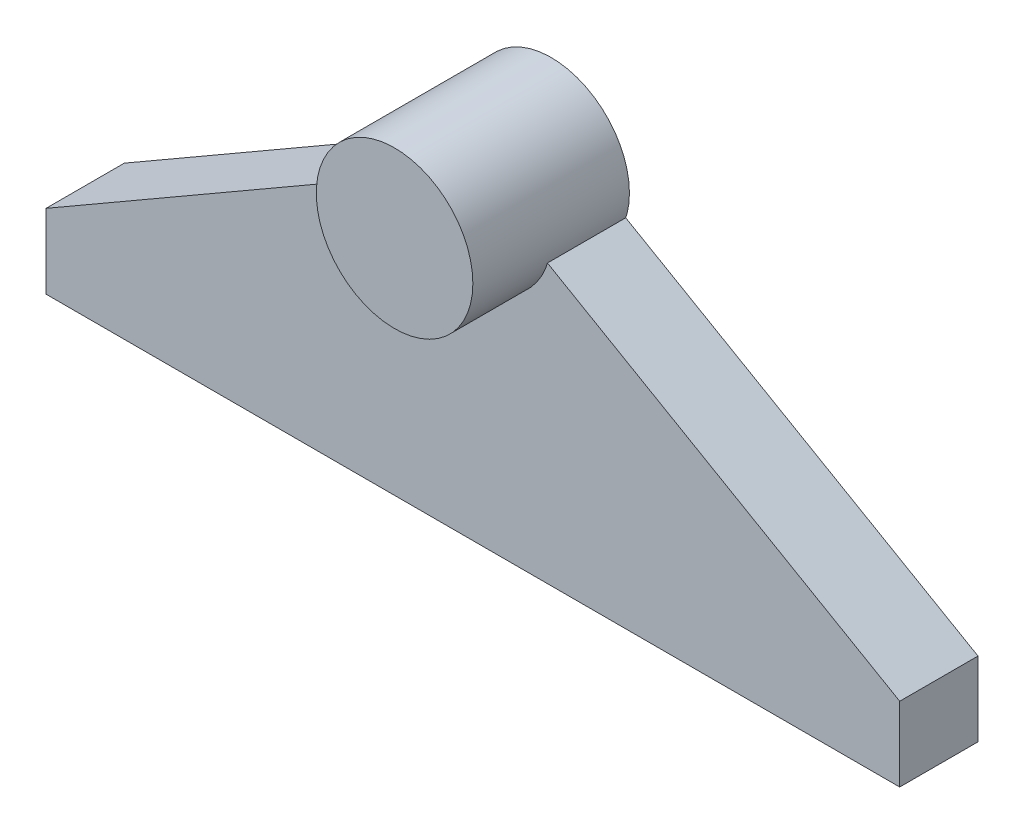
ISO-10303-21;
HEADER;
FILE_DESCRIPTION(('STEP AP214'),'2;1');
FILE_NAME('part.step','',(''),(''),'','','');
FILE_SCHEMA(('AUTOMOTIVE_DESIGN { 1 0 10303 214 1 1 1 1 }'));
ENDSEC;
DATA;
#1=APPLICATION_CONTEXT('core data for automotive mechanical design processes');
#2=APPLICATION_PROTOCOL_DEFINITION('international standard','automotive_design',2000,#1);
#3=PRODUCT_CONTEXT('',#1,'mechanical');
#4=PRODUCT('Part','Part','',(#3));
#5=PRODUCT_RELATED_PRODUCT_CATEGORY('part','',(#4));
#6=PRODUCT_DEFINITION_FORMATION('','',#4);
#7=PRODUCT_DEFINITION_CONTEXT('part definition',#1,'design');
#8=PRODUCT_DEFINITION('design','',#6,#7);
#9=PRODUCT_DEFINITION_SHAPE('','',#8);
#10=(LENGTH_UNIT() NAMED_UNIT(*) SI_UNIT(.MILLI.,.METRE.));
#11=(NAMED_UNIT(*) PLANE_ANGLE_UNIT() SI_UNIT($,.RADIAN.));
#12=(NAMED_UNIT(*) SI_UNIT($,.STERADIAN.) SOLID_ANGLE_UNIT());
#13=UNCERTAINTY_MEASURE_WITH_UNIT(LENGTH_MEASURE(1.E-05),#10,'distance_accuracy_value','');
#14=(GEOMETRIC_REPRESENTATION_CONTEXT(3) GLOBAL_UNCERTAINTY_ASSIGNED_CONTEXT((#13)) GLOBAL_UNIT_ASSIGNED_CONTEXT((#10,
#11,#12)) REPRESENTATION_CONTEXT('',''));
#15=CARTESIAN_POINT('',(0.,0.,0.));
#16=DIRECTION('',(0.,0.,1.));
#17=DIRECTION('',(1.,0.,0.));
#18=AXIS2_PLACEMENT_3D('',#15,#16,#17);
#19=CARTESIAN_POINT('',(0.,0.,100.));
#20=DIRECTION('',(0.,0.,-1.));
#21=DIRECTION('',(-1.,0.,0.));
#22=AXIS2_PLACEMENT_3D('',#19,#20,#21);
#23=CYLINDRICAL_SURFACE('',#22,70.);
#24=CARTESIAN_POINT('',(0.,0.,0.));
#25=DIRECTION('',(0.,0.,1.));
#26=DIRECTION('',(1.,0.,0.));
#27=AXIS2_PLACEMENT_3D('',#24,#25,#26);
#28=CIRCLE('',#27,70.);
#29=CARTESIAN_POINT('',(68.5211856582646,-14.3124811261233,0.));
#30=VERTEX_POINT('',#29);
#31=CARTESIAN_POINT('',(-68.5211856582646,-14.3124811261233,0.));
#32=VERTEX_POINT('',#31);
#33=EDGE_CURVE('E133',#30,#32,#28,.F.);
#34=ORIENTED_EDGE('',*,*,#33,.T.);
#35=DIRECTION('',(0.,0.,-1.));
#36=VECTOR('',#35,1.);
#37=CARTESIAN_POINT('',(-68.5211856582646,-14.3124811261233,100.));
#38=LINE('',#37,#36);
#39=CARTESIAN_POINT('',(-68.5211856582646,-14.3124811261233,100.));
#40=VERTEX_POINT('',#39);
#41=EDGE_CURVE('E12',#40,#32,#38,.T.);
#42=ORIENTED_EDGE('',*,*,#41,.F.);
#43=CARTESIAN_POINT('',(0.,0.,100.));
#44=DIRECTION('',(0.,0.,1.));
#45=DIRECTION('',(1.,0.,0.));
#46=AXIS2_PLACEMENT_3D('',#43,#44,#45);
#47=CIRCLE('',#46,70.);
#48=CARTESIAN_POINT('',(68.5211856582646,-14.3124811261233,100.));
#49=VERTEX_POINT('',#48);
#50=EDGE_CURVE('E144',#49,#40,#47,.F.);
#51=ORIENTED_EDGE('',*,*,#50,.F.);
#52=DIRECTION('',(0.,0.,-1.));
#53=VECTOR('',#52,1.);
#54=CARTESIAN_POINT('',(68.5211856582646,-14.3124811261233,100.));
#55=LINE('',#54,#53);
#56=EDGE_CURVE('E129',#49,#30,#55,.T.);
#57=ORIENTED_EDGE('',*,*,#56,.T.);
#58=EDGE_LOOP('',(#34,#42,#51,#57));
#59=FACE_BOUND('',#58,.T.);
#60=ADVANCED_FACE('F45',(#59),#23,.F.);
#61=CARTESIAN_POINT('',(-97.2483587378723,-30.8981222366915,100.));
#62=DIRECTION('',(0.499999999999995,-0.866025403784441,0.));
#63=DIRECTION('',(0.866025403784442,0.499999999999995,0.));
#64=AXIS2_PLACEMENT_3D('',#61,#62,#63);
#65=PLANE('',#64);
#66=DIRECTION('',(-0.866025403784442,-0.499999999999995,0.));
#67=VECTOR('',#66,1.);
#68=CARTESIAN_POINT('',(-97.2483587378723,-30.8981222366915,0.));
#69=LINE('',#68,#67);
#70=CARTESIAN_POINT('',(-545.261060630093,-289.558376274533,0.));
#71=VERTEX_POINT('',#70);
#72=EDGE_CURVE('E136',#32,#71,#69,.T.);
#73=ORIENTED_EDGE('',*,*,#72,.T.);
#74=DIRECTION('',(0.,0.,-1.));
#75=VECTOR('',#74,1.);
#76=CARTESIAN_POINT('',(-545.261060630093,-289.558376274533,100.));
#77=LINE('',#76,#75);
#78=CARTESIAN_POINT('',(-545.261060630093,-289.558376274533,100.));
#79=VERTEX_POINT('',#78);
#80=EDGE_CURVE('E53',#79,#71,#77,.T.);
#81=ORIENTED_EDGE('',*,*,#80,.F.);
#82=DIRECTION('',(-0.866025403784442,-0.499999999999995,0.));
#83=VECTOR('',#82,1.);
#84=CARTESIAN_POINT('',(-97.2483587378723,-30.8981222366915,100.));
#85=LINE('',#84,#83);
#86=EDGE_CURVE('E99',#40,#79,#85,.T.);
#87=ORIENTED_EDGE('',*,*,#86,.F.);
#88=ORIENTED_EDGE('',*,*,#41,.T.);
#89=EDGE_LOOP('',(#73,#81,#87,#88));
#90=FACE_BOUND('',#89,.T.);
#91=ADVANCED_FACE('F168',(#90),#65,.F.);
#92=CARTESIAN_POINT('',(-545.261060630093,-306.878884350222,100.));
#93=DIRECTION('',(1.,0.,0.));
#94=DIRECTION('',(0.,1.,0.));
#95=AXIS2_PLACEMENT_3D('',#92,#93,#94);
#96=PLANE('',#95);
#97=DIRECTION('',(0.,-1.,0.));
#98=VECTOR('',#97,1.);
#99=CARTESIAN_POINT('',(-545.261060630093,-306.878884350222,0.));
#100=LINE('',#99,#98);
#101=CARTESIAN_POINT('',(-545.261060630094,-384.491692362396,0.));
#102=VERTEX_POINT('',#101);
#103=EDGE_CURVE('E139',#71,#102,#100,.T.);
#104=ORIENTED_EDGE('',*,*,#103,.T.);
#105=DIRECTION('',(0.,0.,-1.));
#106=VECTOR('',#105,1.);
#107=CARTESIAN_POINT('',(-545.261060630094,-384.491692362396,100.));
#108=LINE('',#107,#106);
#109=CARTESIAN_POINT('',(-545.261060630094,-384.491692362396,100.));
#110=VERTEX_POINT('',#109);
#111=EDGE_CURVE('E124',#110,#102,#108,.T.);
#112=ORIENTED_EDGE('',*,*,#111,.F.);
#113=DIRECTION('',(0.,-1.,0.));
#114=VECTOR('',#113,1.);
#115=CARTESIAN_POINT('',(-545.261060630093,-306.878884350222,100.));
#116=LINE('',#115,#114);
#117=EDGE_CURVE('E115',#79,#110,#116,.T.);
#118=ORIENTED_EDGE('',*,*,#117,.F.);
#119=ORIENTED_EDGE('',*,*,#80,.T.);
#120=EDGE_LOOP('',(#104,#112,#118,#119));
#121=FACE_BOUND('',#120,.T.);
#122=ADVANCED_FACE('F150',(#121),#96,.F.);
#123=CARTESIAN_POINT('',(-515.261060630093,-384.491692362396,100.));
#124=DIRECTION('',(0.,1.,0.));
#125=DIRECTION('',(0.,0.,1.));
#126=AXIS2_PLACEMENT_3D('',#123,#124,#125);
#127=PLANE('',#126);
#128=DIRECTION('',(1.,0.,0.));
#129=VECTOR('',#128,1.);
#130=CARTESIAN_POINT('',(-515.261060630093,-384.491692362396,0.));
#131=LINE('',#130,#129);
#132=CARTESIAN_POINT('',(545.261060630093,-384.491692362396,0.));
#133=VERTEX_POINT('',#132);
#134=EDGE_CURVE('E123',#102,#133,#131,.T.);
#135=ORIENTED_EDGE('',*,*,#134,.T.);
#136=DIRECTION('',(0.,0.,-1.));
#137=VECTOR('',#136,1.);
#138=CARTESIAN_POINT('',(545.261060630093,-384.491692362396,100.));
#139=LINE('',#138,#137);
#140=CARTESIAN_POINT('',(545.261060630093,-384.491692362396,100.));
#141=VERTEX_POINT('',#140);
#142=EDGE_CURVE('E120',#141,#133,#139,.T.);
#143=ORIENTED_EDGE('',*,*,#142,.F.);
#144=DIRECTION('',(1.,0.,0.));
#145=VECTOR('',#144,1.);
#146=CARTESIAN_POINT('',(-515.261060630093,-384.491692362396,100.));
#147=LINE('',#146,#145);
#148=EDGE_CURVE('E109',#110,#141,#147,.T.);
#149=ORIENTED_EDGE('',*,*,#148,.F.);
#150=ORIENTED_EDGE('',*,*,#111,.T.);
#151=EDGE_LOOP('',(#135,#143,#149,#150));
#152=FACE_BOUND('',#151,.T.);
#153=ADVANCED_FACE('F121',(#152),#127,.F.);
#154=CARTESIAN_POINT('',(545.261060630093,-354.491692362396,100.));
#155=DIRECTION('',(-1.,0.,0.));
#156=DIRECTION('',(0.,0.,1.));
#157=AXIS2_PLACEMENT_3D('',#154,#155,#156);
#158=PLANE('',#157);
#159=DIRECTION('',(0.,1.,0.));
#160=VECTOR('',#159,1.);
#161=CARTESIAN_POINT('',(545.261060630093,-354.491692362396,0.));
#162=LINE('',#161,#160);
#163=CARTESIAN_POINT('',(545.261060630093,-289.558376274533,0.));
#164=VERTEX_POINT('',#163);
#165=EDGE_CURVE('E85',#133,#164,#162,.T.);
#166=ORIENTED_EDGE('',*,*,#165,.T.);
#167=DIRECTION('',(0.,0.,-1.));
#168=VECTOR('',#167,1.);
#169=CARTESIAN_POINT('',(545.261060630093,-289.558376274533,100.));
#170=LINE('',#169,#168);
#171=CARTESIAN_POINT('',(545.261060630093,-289.558376274533,100.));
#172=VERTEX_POINT('',#171);
#173=EDGE_CURVE('E125',#172,#164,#170,.T.);
#174=ORIENTED_EDGE('',*,*,#173,.F.);
#175=DIRECTION('',(0.,1.,0.));
#176=VECTOR('',#175,1.);
#177=CARTESIAN_POINT('',(545.261060630093,-354.491692362396,100.));
#178=LINE('',#177,#176);
#179=EDGE_CURVE('E113',#141,#172,#178,.T.);
#180=ORIENTED_EDGE('',*,*,#179,.F.);
#181=ORIENTED_EDGE('',*,*,#142,.T.);
#182=EDGE_LOOP('',(#166,#174,#180,#181));
#183=FACE_BOUND('',#182,.T.);
#184=ADVANCED_FACE('F127',(#183),#158,.F.);
#185=CARTESIAN_POINT('',(530.261060630093,-280.898122236689,100.));
#186=DIRECTION('',(-0.499999999999995,-0.866025403784442,0.));
#187=DIRECTION('',(0.866025403784442,-0.499999999999995,0.));
#188=AXIS2_PLACEMENT_3D('',#185,#186,#187);
#189=PLANE('',#188);
#190=DIRECTION('',(-0.866025403784442,0.499999999999995,0.));
#191=VECTOR('',#190,1.);
#192=CARTESIAN_POINT('',(530.261060630093,-280.898122236689,0.));
#193=LINE('',#192,#191);
#194=EDGE_CURVE('E91',#164,#30,#193,.T.);
#195=ORIENTED_EDGE('',*,*,#194,.T.);
#196=ORIENTED_EDGE('',*,*,#56,.F.);
#197=DIRECTION('',(-0.866025403784442,0.499999999999995,0.));
#198=VECTOR('',#197,1.);
#199=CARTESIAN_POINT('',(530.261060630093,-280.898122236689,100.));
#200=LINE('',#199,#198);
#201=EDGE_CURVE('E61',#172,#49,#200,.T.);
#202=ORIENTED_EDGE('',*,*,#201,.F.);
#203=ORIENTED_EDGE('',*,*,#173,.T.);
#204=EDGE_LOOP('',(#195,#196,#202,#203));
#205=FACE_BOUND('',#204,.T.);
#206=ADVANCED_FACE('F157',(#205),#189,.F.);
#207=CARTESIAN_POINT('',(0.,0.,100.));
#208=DIRECTION('',(0.,0.,1.));
#209=DIRECTION('',(1.,0.,0.));
#210=AXIS2_PLACEMENT_3D('',#207,#208,#209);
#211=PLANE('',#210);
#212=ORIENTED_EDGE('',*,*,#50,.T.);
#213=ORIENTED_EDGE('',*,*,#86,.T.);
#214=ORIENTED_EDGE('',*,*,#117,.T.);
#215=ORIENTED_EDGE('',*,*,#148,.T.);
#216=ORIENTED_EDGE('',*,*,#179,.T.);
#217=ORIENTED_EDGE('',*,*,#201,.T.);
#218=EDGE_LOOP('',(#212,#213,#214,#215,#216,#217));
#219=FACE_BOUND('',#218,.T.);
#220=ADVANCED_FACE('F111',(#219),#211,.T.);
#221=CARTESIAN_POINT('',(0.,0.,0.));
#222=DIRECTION('',(0.,0.,1.));
#223=DIRECTION('',(1.,0.,0.));
#224=AXIS2_PLACEMENT_3D('',#221,#222,#223);
#225=PLANE('',#224);
#226=ORIENTED_EDGE('',*,*,#33,.F.);
#227=ORIENTED_EDGE('',*,*,#194,.F.);
#228=ORIENTED_EDGE('',*,*,#165,.F.);
#229=ORIENTED_EDGE('',*,*,#134,.F.);
#230=ORIENTED_EDGE('',*,*,#103,.F.);
#231=ORIENTED_EDGE('',*,*,#72,.F.);
#232=EDGE_LOOP('',(#226,#227,#228,#229,#230,#231));
#233=FACE_BOUND('',#232,.T.);
#234=ADVANCED_FACE('F153',(#233),#225,.F.);
#235=CLOSED_SHELL('',(#60,#91,#122,#153,#184,#206,#220,#234));
#236=CARTESIAN_POINT('',(0.,0.,99.));
#237=DIRECTION('',(0.,0.,-1.));
#238=DIRECTION('',(-1.,0.,0.));
#239=AXIS2_PLACEMENT_3D('',#236,#237,#238);
#240=CYLINDRICAL_SURFACE('',#239,100.);
#241=CARTESIAN_POINT('',(0.,0.,1.));
#242=DIRECTION('',(0.,0.,-1.));
#243=DIRECTION('',(1.,0.,0.));
#244=AXIS2_PLACEMENT_3D('',#241,#242,#243);
#245=CIRCLE('',#244,100.);
#246=CARTESIAN_POINT('',(82.2483587378724,-56.8788843502248,1.));
#247=VERTEX_POINT('',#246);
#248=CARTESIAN_POINT('',(-82.2483587378724,-56.8788843502248,1.));
#249=VERTEX_POINT('',#248);
#250=EDGE_CURVE('E294',#247,#249,#245,.T.);
#251=ORIENTED_EDGE('',*,*,#250,.F.);
#252=DIRECTION('',(0.,0.,-1.));
#253=VECTOR('',#252,1.);
#254=CARTESIAN_POINT('',(82.2483587378724,-56.8788843502248,99.));
#255=LINE('',#254,#253);
#256=CARTESIAN_POINT('',(82.2483587378724,-56.8788843502248,99.));
#257=VERTEX_POINT('',#256);
#258=EDGE_CURVE('E322',#257,#247,#255,.T.);
#259=ORIENTED_EDGE('',*,*,#258,.F.);
#260=CARTESIAN_POINT('',(0.,0.,99.));
#261=DIRECTION('',(0.,0.,-1.));
#262=DIRECTION('',(1.,0.,0.));
#263=AXIS2_PLACEMENT_3D('',#260,#261,#262);
#264=CIRCLE('',#263,100.);
#265=CARTESIAN_POINT('',(-82.2483587378724,-56.8788843502248,99.));
#266=VERTEX_POINT('',#265);
#267=EDGE_CURVE('E321',#257,#266,#264,.T.);
#268=ORIENTED_EDGE('',*,*,#267,.T.);
#269=DIRECTION('',(0.,0.,-1.));
#270=VECTOR('',#269,1.);
#271=CARTESIAN_POINT('',(-82.2483587378724,-56.8788843502248,99.));
#272=LINE('',#271,#270);
#273=EDGE_CURVE('E137',#266,#249,#272,.T.);
#274=ORIENTED_EDGE('',*,*,#273,.T.);
#275=EDGE_LOOP('',(#251,#259,#268,#274));
#276=FACE_BOUND('',#275,.T.);
#277=ADVANCED_FACE('F210',(#276),#240,.T.);
#278=CARTESIAN_POINT('',(-82.2483587378724,-56.8788843502248,99.));
#279=DIRECTION('',(0.499999999999995,-0.866025403784441,0.));
#280=DIRECTION('',(0.866025403784442,0.499999999999995,0.));
#281=AXIS2_PLACEMENT_3D('',#278,#279,#280);
#282=PLANE('',#281);
#283=DIRECTION('',(-0.866025403784442,-0.499999999999995,0.));
#284=VECTOR('',#283,1.);
#285=CARTESIAN_POINT('',(-82.2483587378724,-56.8788843502248,1.));
#286=LINE('',#285,#284);
#287=CARTESIAN_POINT('',(-515.261060630093,-306.878884350222,1.));
#288=VERTEX_POINT('',#287);
#289=EDGE_CURVE('E298',#249,#288,#286,.T.);
#290=ORIENTED_EDGE('',*,*,#289,.F.);
#291=ORIENTED_EDGE('',*,*,#273,.F.);
#292=DIRECTION('',(-0.866025403784442,-0.499999999999995,0.));
#293=VECTOR('',#292,1.);
#294=CARTESIAN_POINT('',(-82.2483587378724,-56.8788843502248,99.));
#295=LINE('',#294,#293);
#296=CARTESIAN_POINT('',(-515.261060630093,-306.878884350222,99.));
#297=VERTEX_POINT('',#296);
#298=EDGE_CURVE('E344',#266,#297,#295,.T.);
#299=ORIENTED_EDGE('',*,*,#298,.T.);
#300=DIRECTION('',(0.,0.,-1.));
#301=VECTOR('',#300,1.);
#302=CARTESIAN_POINT('',(-515.261060630093,-306.878884350222,99.));
#303=LINE('',#302,#301);
#304=EDGE_CURVE('E333',#297,#288,#303,.T.);
#305=ORIENTED_EDGE('',*,*,#304,.T.);
#306=EDGE_LOOP('',(#290,#291,#299,#305));
#307=FACE_BOUND('',#306,.T.);
#308=ADVANCED_FACE('F213',(#307),#282,.T.);
#309=CARTESIAN_POINT('',(-515.261060630093,-306.878884350222,99.));
#310=DIRECTION('',(1.,0.,0.));
#311=DIRECTION('',(0.,1.,0.));
#312=AXIS2_PLACEMENT_3D('',#309,#310,#311);
#313=PLANE('',#312);
#314=DIRECTION('',(0.,-1.,0.));
#315=VECTOR('',#314,1.);
#316=CARTESIAN_POINT('',(-515.261060630093,-306.878884350222,1.));
#317=LINE('',#316,#315);
#318=CARTESIAN_POINT('',(-515.261060630093,-354.491692362396,1.));
#319=VERTEX_POINT('',#318);
#320=EDGE_CURVE('E308',#288,#319,#317,.T.);
#321=ORIENTED_EDGE('',*,*,#320,.F.);
#322=ORIENTED_EDGE('',*,*,#304,.F.);
#323=DIRECTION('',(0.,-1.,0.));
#324=VECTOR('',#323,1.);
#325=CARTESIAN_POINT('',(-515.261060630093,-306.878884350222,99.));
#326=LINE('',#325,#324);
#327=CARTESIAN_POINT('',(-515.261060630093,-354.491692362396,99.));
#328=VERTEX_POINT('',#327);
#329=EDGE_CURVE('E374',#297,#328,#326,.T.);
#330=ORIENTED_EDGE('',*,*,#329,.T.);
#331=DIRECTION('',(0.,0.,-1.));
#332=VECTOR('',#331,1.);
#333=CARTESIAN_POINT('',(-515.261060630093,-354.491692362396,99.));
#334=LINE('',#333,#332);
#335=EDGE_CURVE('E330',#328,#319,#334,.T.);
#336=ORIENTED_EDGE('',*,*,#335,.T.);
#337=EDGE_LOOP('',(#321,#322,#330,#336));
#338=FACE_BOUND('',#337,.T.);
#339=ADVANCED_FACE('F224',(#338),#313,.T.);
#340=CARTESIAN_POINT('',(-515.261060630093,-354.491692362396,99.));
#341=DIRECTION('',(0.,1.,0.));
#342=DIRECTION('',(0.,0.,1.));
#343=AXIS2_PLACEMENT_3D('',#340,#341,#342);
#344=PLANE('',#343);
#345=DIRECTION('',(1.,0.,0.));
#346=VECTOR('',#345,1.);
#347=CARTESIAN_POINT('',(-515.261060630093,-354.491692362396,1.));
#348=LINE('',#347,#346);
#349=CARTESIAN_POINT('',(515.261060630093,-354.491692362396,1.));
#350=VERTEX_POINT('',#349);
#351=EDGE_CURVE('E315',#319,#350,#348,.T.);
#352=ORIENTED_EDGE('',*,*,#351,.F.);
#353=ORIENTED_EDGE('',*,*,#335,.F.);
#354=DIRECTION('',(1.,0.,0.));
#355=VECTOR('',#354,1.);
#356=CARTESIAN_POINT('',(-515.261060630093,-354.491692362396,99.));
#357=LINE('',#356,#355);
#358=CARTESIAN_POINT('',(515.261060630093,-354.491692362396,99.));
#359=VERTEX_POINT('',#358);
#360=EDGE_CURVE('E378',#328,#359,#357,.T.);
#361=ORIENTED_EDGE('',*,*,#360,.T.);
#362=DIRECTION('',(0.,0.,-1.));
#363=VECTOR('',#362,1.);
#364=CARTESIAN_POINT('',(515.261060630093,-354.491692362396,99.));
#365=LINE('',#364,#363);
#366=EDGE_CURVE('E327',#359,#350,#365,.T.);
#367=ORIENTED_EDGE('',*,*,#366,.T.);
#368=EDGE_LOOP('',(#352,#353,#361,#367));
#369=FACE_BOUND('',#368,.T.);
#370=ADVANCED_FACE('F234',(#369),#344,.T.);
#371=CARTESIAN_POINT('',(515.261060630093,-354.491692362396,99.));
#372=DIRECTION('',(-1.,0.,0.));
#373=DIRECTION('',(0.,0.,1.));
#374=AXIS2_PLACEMENT_3D('',#371,#372,#373);
#375=PLANE('',#374);
#376=DIRECTION('',(0.,1.,0.));
#377=VECTOR('',#376,1.);
#378=CARTESIAN_POINT('',(515.261060630093,-354.491692362396,1.));
#379=LINE('',#378,#377);
#380=CARTESIAN_POINT('',(515.261060630093,-306.878884350222,1.));
#381=VERTEX_POINT('',#380);
#382=EDGE_CURVE('E318',#350,#381,#379,.T.);
#383=ORIENTED_EDGE('',*,*,#382,.F.);
#384=ORIENTED_EDGE('',*,*,#366,.F.);
#385=DIRECTION('',(0.,1.,0.));
#386=VECTOR('',#385,1.);
#387=CARTESIAN_POINT('',(515.261060630093,-354.491692362396,99.));
#388=LINE('',#387,#386);
#389=CARTESIAN_POINT('',(515.261060630093,-306.878884350222,99.));
#390=VERTEX_POINT('',#389);
#391=EDGE_CURVE('E371',#359,#390,#388,.T.);
#392=ORIENTED_EDGE('',*,*,#391,.T.);
#393=DIRECTION('',(0.,0.,-1.));
#394=VECTOR('',#393,1.);
#395=CARTESIAN_POINT('',(515.261060630093,-306.878884350222,99.));
#396=LINE('',#395,#394);
#397=EDGE_CURVE('E324',#390,#381,#396,.T.);
#398=ORIENTED_EDGE('',*,*,#397,.T.);
#399=EDGE_LOOP('',(#383,#384,#392,#398));
#400=FACE_BOUND('',#399,.T.);
#401=ADVANCED_FACE('F244',(#400),#375,.T.);
#402=CARTESIAN_POINT('',(515.261060630093,-306.878884350222,99.));
#403=DIRECTION('',(-0.499999999999995,-0.866025403784442,0.));
#404=DIRECTION('',(0.866025403784442,-0.499999999999995,0.));
#405=AXIS2_PLACEMENT_3D('',#402,#403,#404);
#406=PLANE('',#405);
#407=DIRECTION('',(-0.866025403784442,0.499999999999995,0.));
#408=VECTOR('',#407,1.);
#409=CARTESIAN_POINT('',(515.261060630093,-306.878884350222,1.));
#410=LINE('',#409,#408);
#411=EDGE_CURVE('E302',#381,#247,#410,.T.);
#412=ORIENTED_EDGE('',*,*,#411,.F.);
#413=ORIENTED_EDGE('',*,*,#397,.F.);
#414=DIRECTION('',(-0.866025403784442,0.499999999999995,0.));
#415=VECTOR('',#414,1.);
#416=CARTESIAN_POINT('',(515.261060630093,-306.878884350222,99.));
#417=LINE('',#416,#415);
#418=EDGE_CURVE('E311',#390,#257,#417,.T.);
#419=ORIENTED_EDGE('',*,*,#418,.T.);
#420=ORIENTED_EDGE('',*,*,#258,.T.);
#421=EDGE_LOOP('',(#412,#413,#419,#420));
#422=FACE_BOUND('',#421,.T.);
#423=ADVANCED_FACE('F254',(#422),#406,.T.);
#424=CARTESIAN_POINT('',(0.,0.,99.));
#425=DIRECTION('',(0.,0.,-1.));
#426=DIRECTION('',(-1.,0.,0.));
#427=AXIS2_PLACEMENT_3D('',#424,#425,#426);
#428=PLANE('',#427);
#429=ORIENTED_EDGE('',*,*,#267,.F.);
#430=ORIENTED_EDGE('',*,*,#418,.F.);
#431=ORIENTED_EDGE('',*,*,#391,.F.);
#432=ORIENTED_EDGE('',*,*,#360,.F.);
#433=ORIENTED_EDGE('',*,*,#329,.F.);
#434=ORIENTED_EDGE('',*,*,#298,.F.);
#435=EDGE_LOOP('',(#429,#430,#431,#432,#433,#434));
#436=FACE_BOUND('',#435,.T.);
#437=ADVANCED_FACE('F264',(#436),#428,.T.);
#438=CARTESIAN_POINT('',(0.,0.,1.));
#439=DIRECTION('',(0.,0.,-1.));
#440=DIRECTION('',(-1.,0.,0.));
#441=AXIS2_PLACEMENT_3D('',#438,#439,#440);
#442=PLANE('',#441);
#443=ORIENTED_EDGE('',*,*,#250,.T.);
#444=ORIENTED_EDGE('',*,*,#289,.T.);
#445=ORIENTED_EDGE('',*,*,#320,.T.);
#446=ORIENTED_EDGE('',*,*,#351,.T.);
#447=ORIENTED_EDGE('',*,*,#382,.T.);
#448=ORIENTED_EDGE('',*,*,#411,.T.);
#449=EDGE_LOOP('',(#443,#444,#445,#446,#447,#448));
#450=FACE_BOUND('',#449,.T.);
#451=ADVANCED_FACE('F274',(#450),#442,.F.);
#452=CLOSED_SHELL('',(#277,#308,#339,#370,#401,#423,#437,#451));
#453=ORIENTED_CLOSED_SHELL('',*,#452,.T.);
#454=BREP_WITH_VOIDS('B2',#235,(#453));
#455=CARTESIAN_POINT('',(0.,0.,200.));
#456=DIRECTION('',(0.,0.,-1.));
#457=DIRECTION('',(-1.,0.,0.));
#458=AXIS2_PLACEMENT_3D('',#455,#456,#457);
#459=CYLINDRICAL_SURFACE('',#458,100.);
#460=CARTESIAN_POINT('',(0.,0.,200.));
#461=DIRECTION('',(0.,0.,1.));
#462=DIRECTION('',(1.,0.,0.));
#463=AXIS2_PLACEMENT_3D('',#460,#461,#462);
#464=CIRCLE('',#463,100.);
#465=CARTESIAN_POINT('',(100.,0.,200.));
#466=VERTEX_POINT('',#465);
#467=EDGE_CURVE('E43',#466,#466,#464,.T.);
#468=ORIENTED_EDGE('',*,*,#467,.F.);
#469=EDGE_LOOP('',(#468));
#470=FACE_BOUND('',#469,.T.);
#471=CARTESIAN_POINT('',(0.,0.,0.));
#472=DIRECTION('',(0.,0.,1.));
#473=DIRECTION('',(1.,0.,0.));
#474=AXIS2_PLACEMENT_3D('',#471,#472,#473);
#475=CIRCLE('',#474,100.);
#476=CARTESIAN_POINT('',(100.,0.,0.));
#477=VERTEX_POINT('',#476);
#478=EDGE_CURVE('E401',#477,#477,#475,.T.);
#479=ORIENTED_EDGE('',*,*,#478,.T.);
#480=EDGE_LOOP('',(#479));
#481=FACE_BOUND('',#480,.T.);
#482=ADVANCED_FACE('F398',(#470,#481),#459,.T.);
#483=CARTESIAN_POINT('',(0.,0.,200.));
#484=DIRECTION('',(0.,0.,1.));
#485=DIRECTION('',(1.,0.,0.));
#486=AXIS2_PLACEMENT_3D('',#483,#484,#485);
#487=PLANE('',#486);
#488=ORIENTED_EDGE('',*,*,#467,.T.);
#489=EDGE_LOOP('',(#488));
#490=FACE_BOUND('',#489,.T.);
#491=ADVANCED_FACE('F413',(#490),#487,.T.);
#492=CARTESIAN_POINT('',(0.,0.,0.));
#493=DIRECTION('',(0.,0.,1.));
#494=DIRECTION('',(1.,0.,0.));
#495=AXIS2_PLACEMENT_3D('',#492,#493,#494);
#496=PLANE('',#495);
#497=ORIENTED_EDGE('',*,*,#478,.F.);
#498=EDGE_LOOP('',(#497));
#499=FACE_BOUND('',#498,.T.);
#500=ADVANCED_FACE('F411',(#499),#496,.F.);
#501=CLOSED_SHELL('',(#482,#491,#500));
#502=MANIFOLD_SOLID_BREP('B6',#501);
#503=ADVANCED_BREP_SHAPE_REPRESENTATION('',(#18,#454,#502),#14);
#504=SHAPE_DEFINITION_REPRESENTATION(#9,#503);
ENDSEC;
END-ISO-10303-21;
